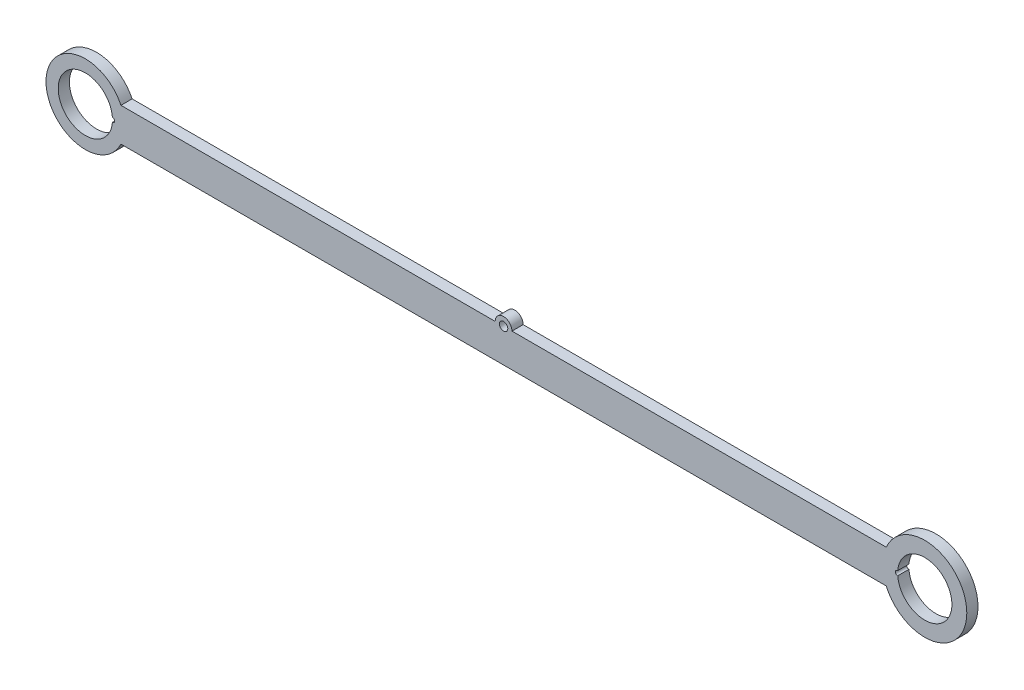
ISO-10303-21;
HEADER;
FILE_DESCRIPTION(('STEP AP214'),'2;1');
FILE_NAME('part.step','',(''),(''),'','','');
FILE_SCHEMA(('AUTOMOTIVE_DESIGN { 1 0 10303 214 1 1 1 1 }'));
ENDSEC;
DATA;
#1=APPLICATION_CONTEXT('core data for automotive mechanical design processes');
#2=APPLICATION_PROTOCOL_DEFINITION('international standard','automotive_design',2000,#1);
#3=PRODUCT_CONTEXT('',#1,'mechanical');
#4=PRODUCT('Part','Part','',(#3));
#5=PRODUCT_RELATED_PRODUCT_CATEGORY('part','',(#4));
#6=PRODUCT_DEFINITION_FORMATION('','',#4);
#7=PRODUCT_DEFINITION_CONTEXT('part definition',#1,'design');
#8=PRODUCT_DEFINITION('design','',#6,#7);
#9=PRODUCT_DEFINITION_SHAPE('','',#8);
#10=(LENGTH_UNIT() NAMED_UNIT(*) SI_UNIT(.MILLI.,.METRE.));
#11=(NAMED_UNIT(*) PLANE_ANGLE_UNIT() SI_UNIT($,.RADIAN.));
#12=(NAMED_UNIT(*) SI_UNIT($,.STERADIAN.) SOLID_ANGLE_UNIT());
#13=UNCERTAINTY_MEASURE_WITH_UNIT(LENGTH_MEASURE(1.E-05),#10,'distance_accuracy_value','');
#14=(GEOMETRIC_REPRESENTATION_CONTEXT(3) GLOBAL_UNCERTAINTY_ASSIGNED_CONTEXT((#13)) GLOBAL_UNIT_ASSIGNED_CONTEXT((#10,
#11,#12)) REPRESENTATION_CONTEXT('',''));
#15=CARTESIAN_POINT('',(0.,0.,0.));
#16=DIRECTION('',(0.,0.,1.));
#17=DIRECTION('',(1.,0.,0.));
#18=AXIS2_PLACEMENT_3D('',#15,#16,#17);
#19=CARTESIAN_POINT('',(12.718684308415,6.,4.));
#20=DIRECTION('',(0.,-1.,0.));
#21=DIRECTION('',(0.,0.,-1.));
#22=AXIS2_PLACEMENT_3D('',#19,#20,#21);
#23=PLANE('',#22);
#24=DIRECTION('',(-1.,0.,0.));
#25=VECTOR('',#24,1.);
#26=CARTESIAN_POINT('',(12.718684308415,6.,0.));
#27=LINE('',#26,#25);
#28=CARTESIAN_POINT('',(286.224480752541,6.,0.));
#29=VERTEX_POINT('',#28);
#30=CARTESIAN_POINT('',(152.471582530478,6.,0.));
#31=VERTEX_POINT('',#30);
#32=EDGE_CURVE('E129',#29,#31,#27,.T.);
#33=ORIENTED_EDGE('',*,*,#32,.T.);
#34=DIRECTION('',(0.,0.,1.));
#35=VECTOR('',#34,1.);
#36=CARTESIAN_POINT('',(152.471582530478,6.,0.));
#37=LINE('',#36,#35);
#38=CARTESIAN_POINT('',(152.471582530478,6.,4.));
#39=VERTEX_POINT('',#38);
#40=EDGE_CURVE('E11',#31,#39,#37,.T.);
#41=ORIENTED_EDGE('',*,*,#40,.T.);
#42=DIRECTION('',(-1.,0.,0.));
#43=VECTOR('',#42,1.);
#44=CARTESIAN_POINT('',(12.718684308415,6.,4.));
#45=LINE('',#44,#43);
#46=CARTESIAN_POINT('',(286.224480752541,6.,4.));
#47=VERTEX_POINT('',#46);
#48=EDGE_CURVE('E127',#47,#39,#45,.T.);
#49=ORIENTED_EDGE('',*,*,#48,.F.);
#50=DIRECTION('',(0.,0.,-1.));
#51=VECTOR('',#50,1.);
#52=CARTESIAN_POINT('',(286.224480752541,6.,4.));
#53=LINE('',#52,#51);
#54=EDGE_CURVE('E142',#47,#29,#53,.T.);
#55=ORIENTED_EDGE('',*,*,#54,.T.);
#56=EDGE_LOOP('',(#33,#41,#49,#55));
#57=FACE_BOUND('',#56,.T.);
#58=ADVANCED_FACE('F39',(#57),#23,.F.);
#59=CARTESIAN_POINT('',(0.,0.,4.));
#60=DIRECTION('',(0.,0.,-1.));
#61=DIRECTION('',(-1.,0.,0.));
#62=AXIS2_PLACEMENT_3D('',#59,#60,#61);
#63=PLANE('',#62);
#64=CARTESIAN_POINT('',(149.471582530478,6.,4.));
#65=DIRECTION('',(0.,0.,1.));
#66=DIRECTION('',(1.,0.,0.));
#67=AXIS2_PLACEMENT_3D('',#64,#65,#66);
#68=CIRCLE('',#67,1.5);
#69=CARTESIAN_POINT('',(150.971582530478,6.,4.));
#70=VERTEX_POINT('',#69);
#71=EDGE_CURVE('E225',#70,#70,#68,.T.);
#72=ORIENTED_EDGE('',*,*,#71,.F.);
#73=EDGE_LOOP('',(#72));
#74=FACE_BOUND('',#73,.T.);
#75=ORIENTED_EDGE('',*,*,#48,.T.);
#76=CARTESIAN_POINT('',(149.471582530478,6.,4.));
#77=DIRECTION('',(0.,0.,1.));
#78=DIRECTION('',(1.,0.,0.));
#79=AXIS2_PLACEMENT_3D('',#76,#77,#78);
#80=CIRCLE('',#79,2.99999999999999);
#81=CARTESIAN_POINT('',(146.471582530478,6.,4.));
#82=VERTEX_POINT('',#81);
#83=EDGE_CURVE('E55',#39,#82,#80,.T.);
#84=ORIENTED_EDGE('',*,*,#83,.T.);
#85=CARTESIAN_POINT('',(12.718684308415,6.,4.));
#86=VERTEX_POINT('',#85);
#87=EDGE_CURVE('E137',#82,#86,#45,.T.);
#88=ORIENTED_EDGE('',*,*,#87,.T.);
#89=CARTESIAN_POINT('',(0.,0.,4.));
#90=DIRECTION('',(0.,0.,1.));
#91=DIRECTION('',(-1.,0.,0.));
#92=AXIS2_PLACEMENT_3D('',#89,#90,#91);
#93=CIRCLE('',#92,14.0628919691904);
#94=CARTESIAN_POINT('',(12.718684308415,-6.,4.));
#95=VERTEX_POINT('',#94);
#96=EDGE_CURVE('E160',#86,#95,#93,.T.);
#97=ORIENTED_EDGE('',*,*,#96,.T.);
#98=DIRECTION('',(1.,0.,0.));
#99=VECTOR('',#98,1.);
#100=CARTESIAN_POINT('',(12.718684308415,-6.,4.));
#101=LINE('',#100,#99);
#102=CARTESIAN_POINT('',(286.224480752541,-5.99999999999999,4.));
#103=VERTEX_POINT('',#102);
#104=EDGE_CURVE('E233',#95,#103,#101,.T.);
#105=ORIENTED_EDGE('',*,*,#104,.T.);
#106=CARTESIAN_POINT('',(300.,0.,4.));
#107=DIRECTION('',(0.,0.,1.));
#108=DIRECTION('',(1.,0.,0.));
#109=AXIS2_PLACEMENT_3D('',#106,#107,#108);
#110=CIRCLE('',#109,15.0254760502661);
#111=EDGE_CURVE('E133',#103,#47,#110,.T.);
#112=ORIENTED_EDGE('',*,*,#111,.T.);
#113=EDGE_LOOP('',(#75,#84,#88,#97,#105,#112));
#114=FACE_BOUND('',#113,.T.);
#115=CARTESIAN_POINT('',(0.,0.,4.));
#116=DIRECTION('',(0.,0.,1.));
#117=DIRECTION('',(1.,0.,0.));
#118=AXIS2_PLACEMENT_3D('',#115,#116,#117);
#119=CIRCLE('',#118,9.7);
#120=CARTESIAN_POINT('',(9.66701030927835,0.799319510775317,4.));
#121=VERTEX_POINT('',#120);
#122=CARTESIAN_POINT('',(9.66701030927835,-0.799319510775317,4.));
#123=VERTEX_POINT('',#122);
#124=EDGE_CURVE('E152',#121,#123,#119,.T.);
#125=ORIENTED_EDGE('',*,*,#124,.F.);
#126=CARTESIAN_POINT('',(9.7,0.,4.));
#127=DIRECTION('',(0.,0.,1.));
#128=DIRECTION('',(1.,0.,0.));
#129=AXIS2_PLACEMENT_3D('',#126,#127,#128);
#130=CIRCLE('',#129,0.800000000000001);
#131=EDGE_CURVE('E63',#123,#121,#130,.T.);
#132=ORIENTED_EDGE('',*,*,#131,.F.);
#133=EDGE_LOOP('',(#125,#132));
#134=FACE_BOUND('',#133,.T.);
#135=CARTESIAN_POINT('',(300.,0.,4.));
#136=DIRECTION('',(0.,0.,1.));
#137=DIRECTION('',(1.,0.,0.));
#138=AXIS2_PLACEMENT_3D('',#135,#136,#137);
#139=CIRCLE('',#138,9.7);
#140=CARTESIAN_POINT('',(290.332989690722,-0.799319510775326,4.));
#141=VERTEX_POINT('',#140);
#142=CARTESIAN_POINT('',(290.332989690722,0.799319510775327,4.));
#143=VERTEX_POINT('',#142);
#144=EDGE_CURVE('E201',#141,#143,#139,.T.);
#145=ORIENTED_EDGE('',*,*,#144,.F.);
#146=CARTESIAN_POINT('',(290.3,0.,4.));
#147=DIRECTION('',(0.,0.,1.));
#148=DIRECTION('',(1.,0.,0.));
#149=AXIS2_PLACEMENT_3D('',#146,#147,#148);
#150=CIRCLE('',#149,0.800000000000011);
#151=EDGE_CURVE('E217',#143,#141,#150,.T.);
#152=ORIENTED_EDGE('',*,*,#151,.F.);
#153=EDGE_LOOP('',(#145,#152));
#154=FACE_BOUND('',#153,.T.);
#155=ADVANCED_FACE('F130',(#74,#114,#134,#154),#63,.F.);
#156=CARTESIAN_POINT('',(0.,0.,0.));
#157=DIRECTION('',(0.,0.,-1.));
#158=DIRECTION('',(-1.,0.,0.));
#159=AXIS2_PLACEMENT_3D('',#156,#157,#158);
#160=PLANE('',#159);
#161=CARTESIAN_POINT('',(149.471582530478,6.,0.));
#162=DIRECTION('',(0.,0.,1.));
#163=DIRECTION('',(1.,0.,0.));
#164=AXIS2_PLACEMENT_3D('',#161,#162,#163);
#165=CIRCLE('',#164,1.5);
#166=CARTESIAN_POINT('',(150.971582530478,6.,0.));
#167=VERTEX_POINT('',#166);
#168=EDGE_CURVE('E121',#167,#167,#165,.T.);
#169=ORIENTED_EDGE('',*,*,#168,.T.);
#170=EDGE_LOOP('',(#169));
#171=FACE_BOUND('',#170,.T.);
#172=CARTESIAN_POINT('',(146.471582530478,6.,0.));
#173=VERTEX_POINT('',#172);
#174=CARTESIAN_POINT('',(12.718684308415,6.,0.));
#175=VERTEX_POINT('',#174);
#176=EDGE_CURVE('E158',#173,#175,#27,.T.);
#177=ORIENTED_EDGE('',*,*,#176,.F.);
#178=CARTESIAN_POINT('',(149.471582530478,6.,0.));
#179=DIRECTION('',(0.,0.,1.));
#180=DIRECTION('',(1.,0.,0.));
#181=AXIS2_PLACEMENT_3D('',#178,#179,#180);
#182=CIRCLE('',#181,2.99999999999999);
#183=EDGE_CURVE('E120',#31,#173,#182,.T.);
#184=ORIENTED_EDGE('',*,*,#183,.F.);
#185=ORIENTED_EDGE('',*,*,#32,.F.);
#186=CARTESIAN_POINT('',(300.,0.,0.));
#187=DIRECTION('',(0.,0.,1.));
#188=DIRECTION('',(1.,0.,0.));
#189=AXIS2_PLACEMENT_3D('',#186,#187,#188);
#190=CIRCLE('',#189,15.0254760502661);
#191=CARTESIAN_POINT('',(286.224480752541,-5.99999999999999,0.));
#192=VERTEX_POINT('',#191);
#193=EDGE_CURVE('E155',#192,#29,#190,.T.);
#194=ORIENTED_EDGE('',*,*,#193,.F.);
#195=DIRECTION('',(1.,0.,0.));
#196=VECTOR('',#195,1.);
#197=CARTESIAN_POINT('',(12.718684308415,-6.,0.));
#198=LINE('',#197,#196);
#199=CARTESIAN_POINT('',(12.718684308415,-6.,0.));
#200=VERTEX_POINT('',#199);
#201=EDGE_CURVE('E151',#200,#192,#198,.T.);
#202=ORIENTED_EDGE('',*,*,#201,.F.);
#203=CARTESIAN_POINT('',(0.,0.,0.));
#204=DIRECTION('',(0.,0.,1.));
#205=DIRECTION('',(-1.,0.,0.));
#206=AXIS2_PLACEMENT_3D('',#203,#204,#205);
#207=CIRCLE('',#206,14.0628919691904);
#208=EDGE_CURVE('E147',#175,#200,#207,.T.);
#209=ORIENTED_EDGE('',*,*,#208,.F.);
#210=EDGE_LOOP('',(#177,#184,#185,#194,#202,#209));
#211=FACE_BOUND('',#210,.T.);
#212=CARTESIAN_POINT('',(9.7,0.,0.));
#213=DIRECTION('',(0.,0.,-1.));
#214=DIRECTION('',(-1.,0.,0.));
#215=AXIS2_PLACEMENT_3D('',#212,#213,#214);
#216=CIRCLE('',#215,0.800000000000001);
#217=CARTESIAN_POINT('',(9.66701030927835,0.799319510775316,0.));
#218=VERTEX_POINT('',#217);
#219=CARTESIAN_POINT('',(9.66701030927835,-0.79931951077531,0.));
#220=VERTEX_POINT('',#219);
#221=EDGE_CURVE('E209',#218,#220,#216,.T.);
#222=ORIENTED_EDGE('',*,*,#221,.F.);
#223=CARTESIAN_POINT('',(0.,0.,0.));
#224=DIRECTION('',(0.,0.,1.));
#225=DIRECTION('',(1.,0.,0.));
#226=AXIS2_PLACEMENT_3D('',#223,#224,#225);
#227=CIRCLE('',#226,9.7);
#228=EDGE_CURVE('E197',#218,#220,#227,.T.);
#229=ORIENTED_EDGE('',*,*,#228,.T.);
#230=EDGE_LOOP('',(#222,#229));
#231=FACE_BOUND('',#230,.T.);
#232=CARTESIAN_POINT('',(290.3,0.,0.));
#233=DIRECTION('',(0.,0.,-1.));
#234=DIRECTION('',(-1.,0.,0.));
#235=AXIS2_PLACEMENT_3D('',#232,#233,#234);
#236=CIRCLE('',#235,0.800000000000011);
#237=CARTESIAN_POINT('',(290.332989690722,-0.799319510775329,0.));
#238=VERTEX_POINT('',#237);
#239=CARTESIAN_POINT('',(290.332989690722,0.799319510775326,0.));
#240=VERTEX_POINT('',#239);
#241=EDGE_CURVE('E212',#238,#240,#236,.T.);
#242=ORIENTED_EDGE('',*,*,#241,.F.);
#243=CARTESIAN_POINT('',(300.,0.,0.));
#244=DIRECTION('',(0.,0.,1.));
#245=DIRECTION('',(1.,0.,0.));
#246=AXIS2_PLACEMENT_3D('',#243,#244,#245);
#247=CIRCLE('',#246,9.7);
#248=EDGE_CURVE('E205',#238,#240,#247,.T.);
#249=ORIENTED_EDGE('',*,*,#248,.T.);
#250=EDGE_LOOP('',(#242,#249));
#251=FACE_BOUND('',#250,.T.);
#252=ADVANCED_FACE('F190',(#171,#211,#231,#251),#160,.T.);
#253=CARTESIAN_POINT('',(0.,0.,4.));
#254=DIRECTION('',(0.,0.,-1.));
#255=DIRECTION('',(-1.,0.,0.));
#256=AXIS2_PLACEMENT_3D('',#253,#254,#255);
#257=CYLINDRICAL_SURFACE('',#256,14.0628919691904);
#258=ORIENTED_EDGE('',*,*,#208,.T.);
#259=DIRECTION('',(0.,0.,-1.));
#260=VECTOR('',#259,1.);
#261=CARTESIAN_POINT('',(12.718684308415,-6.,4.));
#262=LINE('',#261,#260);
#263=EDGE_CURVE('E168',#95,#200,#262,.T.);
#264=ORIENTED_EDGE('',*,*,#263,.F.);
#265=ORIENTED_EDGE('',*,*,#96,.F.);
#266=DIRECTION('',(0.,0.,-1.));
#267=VECTOR('',#266,1.);
#268=CARTESIAN_POINT('',(12.718684308415,6.,4.));
#269=LINE('',#268,#267);
#270=EDGE_CURVE('E136',#86,#175,#269,.T.);
#271=ORIENTED_EDGE('',*,*,#270,.T.);
#272=EDGE_LOOP('',(#258,#264,#265,#271));
#273=FACE_BOUND('',#272,.T.);
#274=ADVANCED_FACE('F41',(#273),#257,.T.);
#275=CARTESIAN_POINT('',(12.718684308415,-6.,4.));
#276=DIRECTION('',(0.,1.,0.));
#277=DIRECTION('',(0.,0.,1.));
#278=AXIS2_PLACEMENT_3D('',#275,#276,#277);
#279=PLANE('',#278);
#280=ORIENTED_EDGE('',*,*,#201,.T.);
#281=DIRECTION('',(0.,0.,-1.));
#282=VECTOR('',#281,1.);
#283=CARTESIAN_POINT('',(286.224480752541,-5.99999999999999,4.));
#284=LINE('',#283,#282);
#285=EDGE_CURVE('E164',#103,#192,#284,.T.);
#286=ORIENTED_EDGE('',*,*,#285,.F.);
#287=ORIENTED_EDGE('',*,*,#104,.F.);
#288=ORIENTED_EDGE('',*,*,#263,.T.);
#289=EDGE_LOOP('',(#280,#286,#287,#288));
#290=FACE_BOUND('',#289,.T.);
#291=ADVANCED_FACE('F240',(#290),#279,.F.);
#292=CARTESIAN_POINT('',(300.,0.,4.));
#293=DIRECTION('',(0.,0.,-1.));
#294=DIRECTION('',(-1.,0.,0.));
#295=AXIS2_PLACEMENT_3D('',#292,#293,#294);
#296=CYLINDRICAL_SURFACE('',#295,15.0254760502661);
#297=ORIENTED_EDGE('',*,*,#193,.T.);
#298=ORIENTED_EDGE('',*,*,#54,.F.);
#299=ORIENTED_EDGE('',*,*,#111,.F.);
#300=ORIENTED_EDGE('',*,*,#285,.T.);
#301=EDGE_LOOP('',(#297,#298,#299,#300));
#302=FACE_BOUND('',#301,.T.);
#303=ADVANCED_FACE('F243',(#302),#296,.T.);
#304=ORIENTED_EDGE('',*,*,#87,.F.);
#305=DIRECTION('',(0.,0.,1.));
#306=VECTOR('',#305,1.);
#307=CARTESIAN_POINT('',(146.471582530478,6.,0.));
#308=LINE('',#307,#306);
#309=EDGE_CURVE('E48',#82,#173,#308,.F.);
#310=ORIENTED_EDGE('',*,*,#309,.T.);
#311=ORIENTED_EDGE('',*,*,#176,.T.);
#312=ORIENTED_EDGE('',*,*,#270,.F.);
#313=EDGE_LOOP('',(#304,#310,#311,#312));
#314=FACE_BOUND('',#313,.T.);
#315=ADVANCED_FACE('F186',(#314),#23,.F.);
#316=CARTESIAN_POINT('',(0.,0.,4.));
#317=DIRECTION('',(0.,0.,-1.));
#318=DIRECTION('',(-1.,0.,0.));
#319=AXIS2_PLACEMENT_3D('',#316,#317,#318);
#320=CYLINDRICAL_SURFACE('',#319,9.7);
#321=DIRECTION('',(0.,0.,1.));
#322=VECTOR('',#321,1.);
#323=CARTESIAN_POINT('',(9.66701030927835,-0.799319510775316,-1.));
#324=LINE('',#323,#322);
#325=EDGE_CURVE('E181',#220,#123,#324,.T.);
#326=ORIENTED_EDGE('',*,*,#325,.F.);
#327=ORIENTED_EDGE('',*,*,#228,.F.);
#328=DIRECTION('',(0.,0.,1.));
#329=VECTOR('',#328,1.);
#330=CARTESIAN_POINT('',(9.66701030927835,0.799319510775316,-1.));
#331=LINE('',#330,#329);
#332=EDGE_CURVE('E178',#121,#218,#331,.F.);
#333=ORIENTED_EDGE('',*,*,#332,.F.);
#334=ORIENTED_EDGE('',*,*,#124,.T.);
#335=EDGE_LOOP('',(#326,#327,#333,#334));
#336=FACE_BOUND('',#335,.T.);
#337=ADVANCED_FACE('F262',(#336),#320,.F.);
#338=CARTESIAN_POINT('',(300.,0.,4.));
#339=DIRECTION('',(0.,0.,-1.));
#340=DIRECTION('',(-1.,0.,0.));
#341=AXIS2_PLACEMENT_3D('',#338,#339,#340);
#342=CYLINDRICAL_SURFACE('',#341,9.7);
#343=DIRECTION('',(0.,0.,1.));
#344=VECTOR('',#343,1.);
#345=CARTESIAN_POINT('',(290.332989690722,0.799319510775327,-1.));
#346=LINE('',#345,#344);
#347=EDGE_CURVE('E175',#240,#143,#346,.T.);
#348=ORIENTED_EDGE('',*,*,#347,.F.);
#349=ORIENTED_EDGE('',*,*,#248,.F.);
#350=DIRECTION('',(0.,0.,1.));
#351=VECTOR('',#350,1.);
#352=CARTESIAN_POINT('',(290.332989690722,-0.799319510775327,-1.));
#353=LINE('',#352,#351);
#354=EDGE_CURVE('E172',#141,#238,#353,.F.);
#355=ORIENTED_EDGE('',*,*,#354,.F.);
#356=ORIENTED_EDGE('',*,*,#144,.T.);
#357=EDGE_LOOP('',(#348,#349,#355,#356));
#358=FACE_BOUND('',#357,.T.);
#359=ADVANCED_FACE('F267',(#358),#342,.F.);
#360=CARTESIAN_POINT('',(290.3,0.,-6.));
#361=DIRECTION('',(0.,0.,1.));
#362=DIRECTION('',(1.,0.,0.));
#363=AXIS2_PLACEMENT_3D('',#360,#361,#362);
#364=CYLINDRICAL_SURFACE('',#363,0.800000000000011);
#365=ORIENTED_EDGE('',*,*,#347,.T.);
#366=ORIENTED_EDGE('',*,*,#151,.T.);
#367=ORIENTED_EDGE('',*,*,#354,.T.);
#368=ORIENTED_EDGE('',*,*,#241,.T.);
#369=EDGE_LOOP('',(#365,#366,#367,#368));
#370=FACE_BOUND('',#369,.T.);
#371=ADVANCED_FACE('F289',(#370),#364,.F.);
#372=CARTESIAN_POINT('',(9.7,0.,-6.));
#373=DIRECTION('',(0.,0.,1.));
#374=DIRECTION('',(1.,0.,0.));
#375=AXIS2_PLACEMENT_3D('',#372,#373,#374);
#376=CYLINDRICAL_SURFACE('',#375,0.800000000000001);
#377=ORIENTED_EDGE('',*,*,#325,.T.);
#378=ORIENTED_EDGE('',*,*,#131,.T.);
#379=ORIENTED_EDGE('',*,*,#332,.T.);
#380=ORIENTED_EDGE('',*,*,#221,.T.);
#381=EDGE_LOOP('',(#377,#378,#379,#380));
#382=FACE_BOUND('',#381,.T.);
#383=ADVANCED_FACE('F297',(#382),#376,.F.);
#384=CARTESIAN_POINT('',(149.471582530478,6.,0.));
#385=DIRECTION('',(0.,0.,1.));
#386=DIRECTION('',(1.,0.,0.));
#387=AXIS2_PLACEMENT_3D('',#384,#385,#386);
#388=CYLINDRICAL_SURFACE('',#387,2.99999999999999);
#389=ORIENTED_EDGE('',*,*,#40,.F.);
#390=ORIENTED_EDGE('',*,*,#183,.T.);
#391=ORIENTED_EDGE('',*,*,#309,.F.);
#392=ORIENTED_EDGE('',*,*,#83,.F.);
#393=EDGE_LOOP('',(#389,#390,#391,#392));
#394=FACE_BOUND('',#393,.T.);
#395=ADVANCED_FACE('F115',(#394),#388,.T.);
#396=CARTESIAN_POINT('',(149.471582530478,6.,0.));
#397=DIRECTION('',(0.,0.,1.));
#398=DIRECTION('',(1.,0.,0.));
#399=AXIS2_PLACEMENT_3D('',#396,#397,#398);
#400=CYLINDRICAL_SURFACE('',#399,1.5);
#401=ORIENTED_EDGE('',*,*,#168,.F.);
#402=EDGE_LOOP('',(#401));
#403=FACE_BOUND('',#402,.T.);
#404=ORIENTED_EDGE('',*,*,#71,.T.);
#405=EDGE_LOOP('',(#404));
#406=FACE_BOUND('',#405,.T.);
#407=ADVANCED_FACE('F322',(#403,#406),#400,.F.);
#408=CLOSED_SHELL('',(#58,#155,#252,#274,#291,#303,#315,#337,#359,#371,#383,#395,#407));
#409=MANIFOLD_SOLID_BREP('B2',#408);
#410=ADVANCED_BREP_SHAPE_REPRESENTATION('',(#18,#409),#14);
#411=SHAPE_DEFINITION_REPRESENTATION(#9,#410);
ENDSEC;
END-ISO-10303-21;
